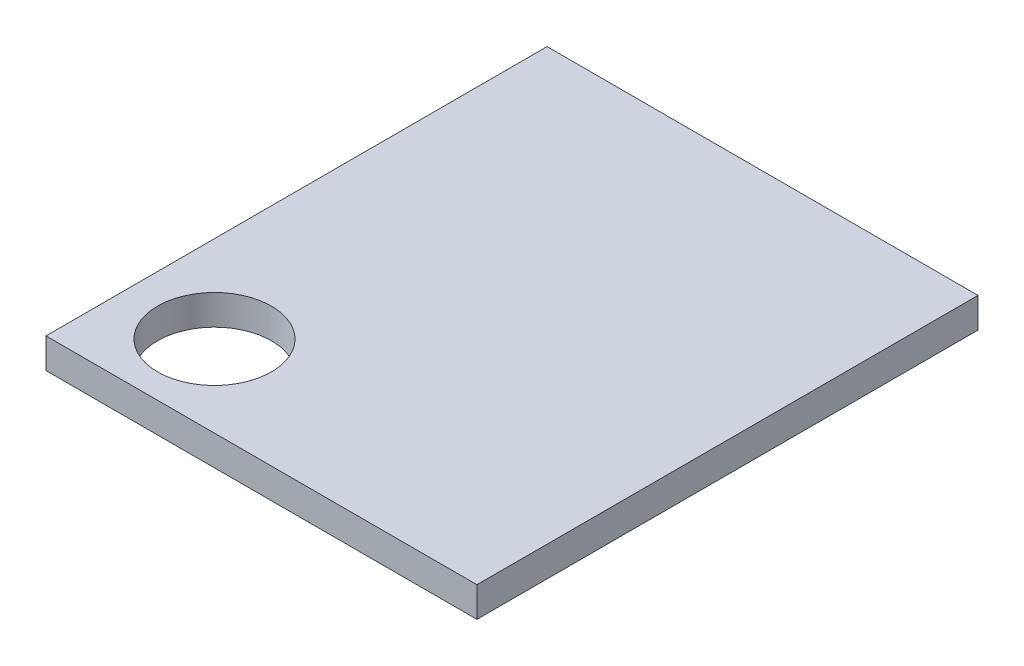
ISO-10303-21;
HEADER;
FILE_DESCRIPTION(('STEP AP214'),'2;1');
FILE_NAME('part.step','',(''),(''),'','','');
FILE_SCHEMA(('AUTOMOTIVE_DESIGN { 1 0 10303 214 1 1 1 1 }'));
ENDSEC;
DATA;
#1=APPLICATION_CONTEXT('core data for automotive mechanical design processes');
#2=APPLICATION_PROTOCOL_DEFINITION('international standard','automotive_design',2000,#1);
#3=PRODUCT_CONTEXT('',#1,'mechanical');
#4=PRODUCT('Part','Part','',(#3));
#5=PRODUCT_RELATED_PRODUCT_CATEGORY('part','',(#4));
#6=PRODUCT_DEFINITION_FORMATION('','',#4);
#7=PRODUCT_DEFINITION_CONTEXT('part definition',#1,'design');
#8=PRODUCT_DEFINITION('design','',#6,#7);
#9=PRODUCT_DEFINITION_SHAPE('','',#8);
#10=(LENGTH_UNIT() NAMED_UNIT(*) SI_UNIT(.MILLI.,.METRE.));
#11=(NAMED_UNIT(*) PLANE_ANGLE_UNIT() SI_UNIT($,.RADIAN.));
#12=(NAMED_UNIT(*) SI_UNIT($,.STERADIAN.) SOLID_ANGLE_UNIT());
#13=UNCERTAINTY_MEASURE_WITH_UNIT(LENGTH_MEASURE(1.E-05),#10,'distance_accuracy_value','');
#14=(GEOMETRIC_REPRESENTATION_CONTEXT(3) GLOBAL_UNCERTAINTY_ASSIGNED_CONTEXT((#13)) GLOBAL_UNIT_ASSIGNED_CONTEXT((#10,
#11,#12)) REPRESENTATION_CONTEXT('',''));
#15=CARTESIAN_POINT('',(0.,0.,0.));
#16=DIRECTION('',(0.,0.,1.));
#17=DIRECTION('',(1.,0.,0.));
#18=AXIS2_PLACEMENT_3D('',#15,#16,#17);
#19=CARTESIAN_POINT('',(0.,0.,250.));
#20=DIRECTION('',(1.,0.,0.));
#21=DIRECTION('',(0.,0.,-1.));
#22=AXIS2_PLACEMENT_3D('',#19,#20,#21);
#23=PLANE('',#22);
#24=DIRECTION('',(0.,-1.,0.));
#25=VECTOR('',#24,1.);
#26=CARTESIAN_POINT('',(0.,0.,0.));
#27=LINE('',#26,#25);
#28=CARTESIAN_POINT('',(0.,15.,0.));
#29=VERTEX_POINT('',#28);
#30=CARTESIAN_POINT('',(0.,0.,0.));
#31=VERTEX_POINT('',#30);
#32=EDGE_CURVE('E107',#29,#31,#27,.T.);
#33=ORIENTED_EDGE('',*,*,#32,.T.);
#34=DIRECTION('',(0.,0.,-1.));
#35=VECTOR('',#34,1.);
#36=CARTESIAN_POINT('',(0.,0.,250.));
#37=LINE('',#36,#35);
#38=CARTESIAN_POINT('',(0.,0.,250.));
#39=VERTEX_POINT('',#38);
#40=EDGE_CURVE('E11',#39,#31,#37,.T.);
#41=ORIENTED_EDGE('',*,*,#40,.F.);
#42=DIRECTION('',(0.,-1.,0.));
#43=VECTOR('',#42,1.);
#44=CARTESIAN_POINT('',(0.,0.,250.));
#45=LINE('',#44,#43);
#46=CARTESIAN_POINT('',(0.,15.,250.));
#47=VERTEX_POINT('',#46);
#48=EDGE_CURVE('E91',#47,#39,#45,.T.);
#49=ORIENTED_EDGE('',*,*,#48,.F.);
#50=DIRECTION('',(0.,0.,-1.));
#51=VECTOR('',#50,1.);
#52=CARTESIAN_POINT('',(0.,15.,250.));
#53=LINE('',#52,#51);
#54=EDGE_CURVE('E103',#47,#29,#53,.T.);
#55=ORIENTED_EDGE('',*,*,#54,.T.);
#56=EDGE_LOOP('',(#33,#41,#49,#55));
#57=FACE_BOUND('',#56,.T.);
#58=ADVANCED_FACE('F39',(#57),#23,.F.);
#59=CARTESIAN_POINT('',(0.,0.,250.));
#60=DIRECTION('',(0.,1.,0.));
#61=DIRECTION('',(0.,0.,1.));
#62=AXIS2_PLACEMENT_3D('',#59,#60,#61);
#63=PLANE('',#62);
#64=CARTESIAN_POINT('',(43.3627599136234,0.,209.297264428606));
#65=DIRECTION('',(0.,1.,0.));
#66=DIRECTION('',(0.,0.,1.));
#67=AXIS2_PLACEMENT_3D('',#64,#65,#66);
#68=CIRCLE('',#67,28.4298666417835);
#69=CARTESIAN_POINT('',(43.3627599136234,0.,237.727131070389));
#70=VERTEX_POINT('',#69);
#71=EDGE_CURVE('E111',#70,#70,#68,.T.);
#72=ORIENTED_EDGE('',*,*,#71,.T.);
#73=EDGE_LOOP('',(#72));
#74=FACE_BOUND('',#73,.T.);
#75=DIRECTION('',(1.,0.,0.));
#76=VECTOR('',#75,1.);
#77=CARTESIAN_POINT('',(0.,0.,0.));
#78=LINE('',#77,#76);
#79=CARTESIAN_POINT('',(215.,0.,0.));
#80=VERTEX_POINT('',#79);
#81=EDGE_CURVE('E96',#31,#80,#78,.T.);
#82=ORIENTED_EDGE('',*,*,#81,.T.);
#83=DIRECTION('',(0.,0.,-1.));
#84=VECTOR('',#83,1.);
#85=CARTESIAN_POINT('',(215.,0.,250.));
#86=LINE('',#85,#84);
#87=CARTESIAN_POINT('',(215.,0.,250.));
#88=VERTEX_POINT('',#87);
#89=EDGE_CURVE('E48',#88,#80,#86,.T.);
#90=ORIENTED_EDGE('',*,*,#89,.F.);
#91=DIRECTION('',(1.,0.,0.));
#92=VECTOR('',#91,1.);
#93=CARTESIAN_POINT('',(0.,0.,250.));
#94=LINE('',#93,#92);
#95=EDGE_CURVE('E86',#39,#88,#94,.T.);
#96=ORIENTED_EDGE('',*,*,#95,.F.);
#97=ORIENTED_EDGE('',*,*,#40,.T.);
#98=EDGE_LOOP('',(#82,#90,#96,#97));
#99=FACE_BOUND('',#98,.T.);
#100=ADVANCED_FACE('F95',(#74,#99),#63,.F.);
#101=CARTESIAN_POINT('',(215.,0.,250.));
#102=DIRECTION('',(-1.,0.,0.));
#103=DIRECTION('',(0.,0.,1.));
#104=AXIS2_PLACEMENT_3D('',#101,#102,#103);
#105=PLANE('',#104);
#106=DIRECTION('',(0.,1.,0.));
#107=VECTOR('',#106,1.);
#108=CARTESIAN_POINT('',(215.,0.,0.));
#109=LINE('',#108,#107);
#110=CARTESIAN_POINT('',(215.,15.,0.));
#111=VERTEX_POINT('',#110);
#112=EDGE_CURVE('E73',#80,#111,#109,.T.);
#113=ORIENTED_EDGE('',*,*,#112,.T.);
#114=DIRECTION('',(0.,0.,-1.));
#115=VECTOR('',#114,1.);
#116=CARTESIAN_POINT('',(215.,15.,250.));
#117=LINE('',#116,#115);
#118=CARTESIAN_POINT('',(215.,15.,250.));
#119=VERTEX_POINT('',#118);
#120=EDGE_CURVE('E98',#119,#111,#117,.T.);
#121=ORIENTED_EDGE('',*,*,#120,.F.);
#122=DIRECTION('',(0.,1.,0.));
#123=VECTOR('',#122,1.);
#124=CARTESIAN_POINT('',(215.,0.,250.));
#125=LINE('',#124,#123);
#126=EDGE_CURVE('E89',#88,#119,#125,.T.);
#127=ORIENTED_EDGE('',*,*,#126,.F.);
#128=ORIENTED_EDGE('',*,*,#89,.T.);
#129=EDGE_LOOP('',(#113,#121,#127,#128));
#130=FACE_BOUND('',#129,.T.);
#131=ADVANCED_FACE('F99',(#130),#105,.F.);
#132=CARTESIAN_POINT('',(0.,15.,250.));
#133=DIRECTION('',(0.,-1.,0.));
#134=DIRECTION('',(0.,0.,-1.));
#135=AXIS2_PLACEMENT_3D('',#132,#133,#134);
#136=PLANE('',#135);
#137=CARTESIAN_POINT('',(43.3627599136234,15.,209.297264428606));
#138=DIRECTION('',(0.,1.,0.));
#139=DIRECTION('',(0.,0.,1.));
#140=AXIS2_PLACEMENT_3D('',#137,#138,#139);
#141=CIRCLE('',#140,28.4298666417835);
#142=CARTESIAN_POINT('',(43.3627599136234,15.,237.727131070389));
#143=VERTEX_POINT('',#142);
#144=EDGE_CURVE('E131',#143,#143,#141,.T.);
#145=ORIENTED_EDGE('',*,*,#144,.F.);
#146=EDGE_LOOP('',(#145));
#147=FACE_BOUND('',#146,.T.);
#148=DIRECTION('',(-1.,0.,0.));
#149=VECTOR('',#148,1.);
#150=CARTESIAN_POINT('',(0.,15.,0.));
#151=LINE('',#150,#149);
#152=EDGE_CURVE('E79',#111,#29,#151,.T.);
#153=ORIENTED_EDGE('',*,*,#152,.T.);
#154=ORIENTED_EDGE('',*,*,#54,.F.);
#155=DIRECTION('',(-1.,0.,0.));
#156=VECTOR('',#155,1.);
#157=CARTESIAN_POINT('',(0.,15.,250.));
#158=LINE('',#157,#156);
#159=EDGE_CURVE('E56',#119,#47,#158,.T.);
#160=ORIENTED_EDGE('',*,*,#159,.F.);
#161=ORIENTED_EDGE('',*,*,#120,.T.);
#162=EDGE_LOOP('',(#153,#154,#160,#161));
#163=FACE_BOUND('',#162,.T.);
#164=ADVANCED_FACE('F121',(#147,#163),#136,.F.);
#165=CARTESIAN_POINT('',(0.,0.,250.));
#166=DIRECTION('',(0.,0.,-1.));
#167=DIRECTION('',(-1.,0.,0.));
#168=AXIS2_PLACEMENT_3D('',#165,#166,#167);
#169=PLANE('',#168);
#170=ORIENTED_EDGE('',*,*,#48,.T.);
#171=ORIENTED_EDGE('',*,*,#95,.T.);
#172=ORIENTED_EDGE('',*,*,#126,.T.);
#173=ORIENTED_EDGE('',*,*,#159,.T.);
#174=EDGE_LOOP('',(#170,#171,#172,#173));
#175=FACE_BOUND('',#174,.T.);
#176=ADVANCED_FACE('F87',(#175),#169,.F.);
#177=CARTESIAN_POINT('',(0.,0.,0.));
#178=DIRECTION('',(0.,0.,-1.));
#179=DIRECTION('',(-1.,0.,0.));
#180=AXIS2_PLACEMENT_3D('',#177,#178,#179);
#181=PLANE('',#180);
#182=ORIENTED_EDGE('',*,*,#32,.F.);
#183=ORIENTED_EDGE('',*,*,#152,.F.);
#184=ORIENTED_EDGE('',*,*,#112,.F.);
#185=ORIENTED_EDGE('',*,*,#81,.F.);
#186=EDGE_LOOP('',(#182,#183,#184,#185));
#187=FACE_BOUND('',#186,.T.);
#188=ADVANCED_FACE('F124',(#187),#181,.T.);
#189=CARTESIAN_POINT('',(43.3627599136234,-235.,209.297264428606));
#190=DIRECTION('',(0.,1.,0.));
#191=DIRECTION('',(0.,0.,1.));
#192=AXIS2_PLACEMENT_3D('',#189,#190,#191);
#193=CYLINDRICAL_SURFACE('',#192,28.4298666417835);
#194=ORIENTED_EDGE('',*,*,#144,.T.);
#195=EDGE_LOOP('',(#194));
#196=FACE_BOUND('',#195,.T.);
#197=ORIENTED_EDGE('',*,*,#71,.F.);
#198=EDGE_LOOP('',(#197));
#199=FACE_BOUND('',#198,.T.);
#200=ADVANCED_FACE('F136',(#196,#199),#193,.F.);
#201=CLOSED_SHELL('',(#58,#100,#131,#164,#176,#188,#200));
#202=MANIFOLD_SOLID_BREP('B2',#201);
#203=ADVANCED_BREP_SHAPE_REPRESENTATION('',(#18,#202),#14);
#204=SHAPE_DEFINITION_REPRESENTATION(#9,#203);
ENDSEC;
END-ISO-10303-21;
